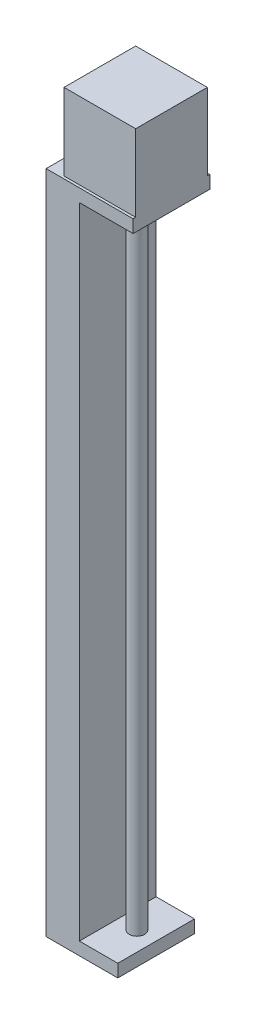
ISO-10303-21;
HEADER;
FILE_DESCRIPTION(('STEP AP214'),'2;1');
FILE_NAME('part.step','',(''),(''),'','','');
FILE_SCHEMA(('AUTOMOTIVE_DESIGN { 1 0 10303 214 1 1 1 1 }'));
ENDSEC;
DATA;
#1=APPLICATION_CONTEXT('core data for automotive mechanical design processes');
#2=APPLICATION_PROTOCOL_DEFINITION('international standard','automotive_design',2000,#1);
#3=PRODUCT_CONTEXT('',#1,'mechanical');
#4=PRODUCT('Part','Part','',(#3));
#5=PRODUCT_RELATED_PRODUCT_CATEGORY('part','',(#4));
#6=PRODUCT_DEFINITION_FORMATION('','',#4);
#7=PRODUCT_DEFINITION_CONTEXT('part definition',#1,'design');
#8=PRODUCT_DEFINITION('design','',#6,#7);
#9=PRODUCT_DEFINITION_SHAPE('','',#8);
#10=(LENGTH_UNIT() NAMED_UNIT(*) SI_UNIT(.MILLI.,.METRE.));
#11=(NAMED_UNIT(*) PLANE_ANGLE_UNIT() SI_UNIT($,.RADIAN.));
#12=(NAMED_UNIT(*) SI_UNIT($,.STERADIAN.) SOLID_ANGLE_UNIT());
#13=UNCERTAINTY_MEASURE_WITH_UNIT(LENGTH_MEASURE(1.E-05),#10,'distance_accuracy_value','');
#14=(GEOMETRIC_REPRESENTATION_CONTEXT(3) GLOBAL_UNCERTAINTY_ASSIGNED_CONTEXT((#13)) GLOBAL_UNIT_ASSIGNED_CONTEXT((#10,
#11,#12)) REPRESENTATION_CONTEXT('',''));
#15=CARTESIAN_POINT('',(0.,0.,0.));
#16=DIRECTION('',(0.,0.,1.));
#17=DIRECTION('',(1.,0.,0.));
#18=AXIS2_PLACEMENT_3D('',#15,#16,#17);
#19=CARTESIAN_POINT('',(0.,130.,15.));
#20=DIRECTION('',(0.,1.,0.));
#21=DIRECTION('',(0.,0.,1.));
#22=AXIS2_PLACEMENT_3D('',#19,#20,#21);
#23=PLANE('',#22);
#24=DIRECTION('',(0.,0.,-1.));
#25=VECTOR('',#24,1.);
#26=CARTESIAN_POINT('',(-11.,130.,14.));
#27=LINE('',#26,#25);
#28=CARTESIAN_POINT('',(-11.,130.,14.));
#29=VERTEX_POINT('',#28);
#30=CARTESIAN_POINT('',(-11.,130.,-14.));
#31=VERTEX_POINT('',#30);
#32=EDGE_CURVE('E216',#29,#31,#27,.T.);
#33=ORIENTED_EDGE('',*,*,#32,.T.);
#34=DIRECTION('',(1.,0.,0.));
#35=VECTOR('',#34,1.);
#36=CARTESIAN_POINT('',(0.,130.,-14.));
#37=LINE('',#36,#35);
#38=CARTESIAN_POINT('',(17.,130.,-14.));
#39=VERTEX_POINT('',#38);
#40=EDGE_CURVE('E50',#31,#39,#37,.T.);
#41=ORIENTED_EDGE('',*,*,#40,.T.);
#42=DIRECTION('',(0.,0.,-1.));
#43=VECTOR('',#42,1.);
#44=CARTESIAN_POINT('',(17.,130.,15.));
#45=LINE('',#44,#43);
#46=CARTESIAN_POINT('',(17.,130.,-15.));
#47=VERTEX_POINT('',#46);
#48=EDGE_CURVE('E175',#39,#47,#45,.T.);
#49=ORIENTED_EDGE('',*,*,#48,.T.);
#50=DIRECTION('',(1.,0.,0.));
#51=VECTOR('',#50,1.);
#52=CARTESIAN_POINT('',(0.,130.,-15.));
#53=LINE('',#52,#51);
#54=CARTESIAN_POINT('',(-17.,130.,-15.));
#55=VERTEX_POINT('',#54);
#56=EDGE_CURVE('E152',#55,#47,#53,.T.);
#57=ORIENTED_EDGE('',*,*,#56,.F.);
#58=DIRECTION('',(0.,0.,-1.));
#59=VECTOR('',#58,1.);
#60=CARTESIAN_POINT('',(-17.,130.,15.));
#61=LINE('',#60,#59);
#62=CARTESIAN_POINT('',(-17.,130.,15.));
#63=VERTEX_POINT('',#62);
#64=EDGE_CURVE('E173',#63,#55,#61,.T.);
#65=ORIENTED_EDGE('',*,*,#64,.F.);
#66=DIRECTION('',(1.,0.,0.));
#67=VECTOR('',#66,1.);
#68=CARTESIAN_POINT('',(0.,130.,15.));
#69=LINE('',#68,#67);
#70=CARTESIAN_POINT('',(17.,130.,15.));
#71=VERTEX_POINT('',#70);
#72=EDGE_CURVE('E233',#63,#71,#69,.T.);
#73=ORIENTED_EDGE('',*,*,#72,.T.);
#74=CARTESIAN_POINT('',(17.,130.,14.));
#75=VERTEX_POINT('',#74);
#76=EDGE_CURVE('E176',#71,#75,#45,.T.);
#77=ORIENTED_EDGE('',*,*,#76,.T.);
#78=DIRECTION('',(1.,0.,0.));
#79=VECTOR('',#78,1.);
#80=CARTESIAN_POINT('',(0.,130.,14.));
#81=LINE('',#80,#79);
#82=EDGE_CURVE('E204',#29,#75,#81,.T.);
#83=ORIENTED_EDGE('',*,*,#82,.F.);
#84=EDGE_LOOP('',(#33,#41,#49,#57,#65,#73,#77,#83));
#85=FACE_BOUND('',#84,.T.);
#86=ADVANCED_FACE('F35',(#85),#23,.T.);
#87=CARTESIAN_POINT('',(0.,125.,15.));
#88=DIRECTION('',(0.,-1.,0.));
#89=DIRECTION('',(0.,0.,-1.));
#90=AXIS2_PLACEMENT_3D('',#87,#88,#89);
#91=PLANE('',#90);
#92=CARTESIAN_POINT('',(3.50000000000015,125.,0.));
#93=DIRECTION('',(0.,-1.,0.));
#94=DIRECTION('',(0.,0.,-1.));
#95=AXIS2_PLACEMENT_3D('',#92,#93,#94);
#96=CIRCLE('',#95,3.);
#97=CARTESIAN_POINT('',(3.50000000000015,125.,-3.));
#98=VERTEX_POINT('',#97);
#99=EDGE_CURVE('E198',#98,#98,#96,.T.);
#100=ORIENTED_EDGE('',*,*,#99,.F.);
#101=EDGE_LOOP('',(#100));
#102=FACE_BOUND('',#101,.T.);
#103=DIRECTION('',(-1.,0.,0.));
#104=VECTOR('',#103,1.);
#105=CARTESIAN_POINT('',(0.,125.,-15.));
#106=LINE('',#105,#104);
#107=CARTESIAN_POINT('',(17.,125.,-15.));
#108=VERTEX_POINT('',#107);
#109=CARTESIAN_POINT('',(-4.,125.,-15.));
#110=VERTEX_POINT('',#109);
#111=EDGE_CURVE('E146',#108,#110,#106,.T.);
#112=ORIENTED_EDGE('',*,*,#111,.F.);
#113=DIRECTION('',(0.,0.,-1.));
#114=VECTOR('',#113,1.);
#115=CARTESIAN_POINT('',(17.,125.,15.));
#116=LINE('',#115,#114);
#117=CARTESIAN_POINT('',(17.,125.,15.));
#118=VERTEX_POINT('',#117);
#119=EDGE_CURVE('E43',#118,#108,#116,.T.);
#120=ORIENTED_EDGE('',*,*,#119,.F.);
#121=DIRECTION('',(-1.,0.,0.));
#122=VECTOR('',#121,1.);
#123=CARTESIAN_POINT('',(0.,125.,15.));
#124=LINE('',#123,#122);
#125=CARTESIAN_POINT('',(-4.,125.,15.));
#126=VERTEX_POINT('',#125);
#127=EDGE_CURVE('E167',#118,#126,#124,.T.);
#128=ORIENTED_EDGE('',*,*,#127,.T.);
#129=DIRECTION('',(0.,0.,-1.));
#130=VECTOR('',#129,1.);
#131=CARTESIAN_POINT('',(-4.,125.,15.));
#132=LINE('',#131,#130);
#133=EDGE_CURVE('E59',#126,#110,#132,.T.);
#134=ORIENTED_EDGE('',*,*,#133,.T.);
#135=EDGE_LOOP('',(#112,#120,#128,#134));
#136=FACE_BOUND('',#135,.T.);
#137=ADVANCED_FACE('F37',(#102,#136),#91,.T.);
#138=CARTESIAN_POINT('',(17.,0.,15.));
#139=DIRECTION('',(-1.,0.,0.));
#140=DIRECTION('',(0.,0.,1.));
#141=AXIS2_PLACEMENT_3D('',#138,#139,#140);
#142=PLANE('',#141);
#143=DIRECTION('',(0.,1.,0.));
#144=VECTOR('',#143,1.);
#145=CARTESIAN_POINT('',(17.,0.,-15.));
#146=LINE('',#145,#144);
#147=EDGE_CURVE('E148',#108,#47,#146,.T.);
#148=ORIENTED_EDGE('',*,*,#147,.T.);
#149=ORIENTED_EDGE('',*,*,#48,.F.);
#150=DIRECTION('',(0.,1.,0.));
#151=VECTOR('',#150,1.);
#152=CARTESIAN_POINT('',(17.,0.,-14.));
#153=LINE('',#152,#151);
#154=CARTESIAN_POINT('',(17.,160.,-14.));
#155=VERTEX_POINT('',#154);
#156=EDGE_CURVE('E201',#39,#155,#153,.T.);
#157=ORIENTED_EDGE('',*,*,#156,.T.);
#158=DIRECTION('',(0.,0.,-1.));
#159=VECTOR('',#158,1.);
#160=CARTESIAN_POINT('',(17.,160.,14.));
#161=LINE('',#160,#159);
#162=CARTESIAN_POINT('',(17.,160.,14.));
#163=VERTEX_POINT('',#162);
#164=EDGE_CURVE('E149',#163,#155,#161,.T.);
#165=ORIENTED_EDGE('',*,*,#164,.F.);
#166=DIRECTION('',(0.,1.,0.));
#167=VECTOR('',#166,1.);
#168=CARTESIAN_POINT('',(17.,0.,14.));
#169=LINE('',#168,#167);
#170=EDGE_CURVE('E207',#75,#163,#169,.T.);
#171=ORIENTED_EDGE('',*,*,#170,.F.);
#172=ORIENTED_EDGE('',*,*,#76,.F.);
#173=DIRECTION('',(0.,1.,0.));
#174=VECTOR('',#173,1.);
#175=CARTESIAN_POINT('',(17.,0.,15.));
#176=LINE('',#175,#174);
#177=EDGE_CURVE('E183',#118,#71,#176,.T.);
#178=ORIENTED_EDGE('',*,*,#177,.F.);
#179=ORIENTED_EDGE('',*,*,#119,.T.);
#180=EDGE_LOOP('',(#148,#149,#157,#165,#171,#172,#178,#179));
#181=FACE_BOUND('',#180,.T.);
#182=ADVANCED_FACE('F180',(#181),#142,.F.);
#183=CARTESIAN_POINT('',(-17.,0.,15.));
#184=DIRECTION('',(-1.,0.,0.));
#185=DIRECTION('',(0.,0.,1.));
#186=AXIS2_PLACEMENT_3D('',#183,#184,#185);
#187=PLANE('',#186);
#188=DIRECTION('',(0.,1.,0.));
#189=VECTOR('',#188,1.);
#190=CARTESIAN_POINT('',(-17.,0.,-15.));
#191=LINE('',#190,#189);
#192=CARTESIAN_POINT('',(-17.,-130.,-15.));
#193=VERTEX_POINT('',#192);
#194=EDGE_CURVE('E155',#193,#55,#191,.T.);
#195=ORIENTED_EDGE('',*,*,#194,.F.);
#196=DIRECTION('',(0.,0.,-1.));
#197=VECTOR('',#196,1.);
#198=CARTESIAN_POINT('',(-17.,-130.,15.));
#199=LINE('',#198,#197);
#200=CARTESIAN_POINT('',(-17.,-130.,15.));
#201=VERTEX_POINT('',#200);
#202=EDGE_CURVE('E171',#201,#193,#199,.T.);
#203=ORIENTED_EDGE('',*,*,#202,.F.);
#204=DIRECTION('',(0.,1.,0.));
#205=VECTOR('',#204,1.);
#206=CARTESIAN_POINT('',(-17.,0.,15.));
#207=LINE('',#206,#205);
#208=EDGE_CURVE('E141',#201,#63,#207,.T.);
#209=ORIENTED_EDGE('',*,*,#208,.T.);
#210=ORIENTED_EDGE('',*,*,#64,.T.);
#211=EDGE_LOOP('',(#195,#203,#209,#210));
#212=FACE_BOUND('',#211,.T.);
#213=ADVANCED_FACE('F193',(#212),#187,.T.);
#214=CARTESIAN_POINT('',(0.,-130.,15.));
#215=DIRECTION('',(0.,1.,0.));
#216=DIRECTION('',(0.,0.,1.));
#217=AXIS2_PLACEMENT_3D('',#214,#215,#216);
#218=PLANE('',#217);
#219=DIRECTION('',(1.,0.,0.));
#220=VECTOR('',#219,1.);
#221=CARTESIAN_POINT('',(0.,-130.,-15.));
#222=LINE('',#221,#220);
#223=CARTESIAN_POINT('',(11.,-130.,-15.));
#224=VERTEX_POINT('',#223);
#225=EDGE_CURVE('E158',#193,#224,#222,.T.);
#226=ORIENTED_EDGE('',*,*,#225,.T.);
#227=DIRECTION('',(0.,0.,-1.));
#228=VECTOR('',#227,1.);
#229=CARTESIAN_POINT('',(11.,-130.,15.));
#230=LINE('',#229,#228);
#231=CARTESIAN_POINT('',(11.,-130.,15.));
#232=VERTEX_POINT('',#231);
#233=EDGE_CURVE('E124',#232,#224,#230,.T.);
#234=ORIENTED_EDGE('',*,*,#233,.F.);
#235=DIRECTION('',(1.,0.,0.));
#236=VECTOR('',#235,1.);
#237=CARTESIAN_POINT('',(0.,-130.,15.));
#238=LINE('',#237,#236);
#239=EDGE_CURVE('E138',#201,#232,#238,.T.);
#240=ORIENTED_EDGE('',*,*,#239,.F.);
#241=ORIENTED_EDGE('',*,*,#202,.T.);
#242=EDGE_LOOP('',(#226,#234,#240,#241));
#243=FACE_BOUND('',#242,.T.);
#244=ADVANCED_FACE('F243',(#243),#218,.F.);
#245=CARTESIAN_POINT('',(11.,0.,15.));
#246=DIRECTION('',(1.,0.,0.));
#247=DIRECTION('',(0.,0.,-1.));
#248=AXIS2_PLACEMENT_3D('',#245,#246,#247);
#249=PLANE('',#248);
#250=DIRECTION('',(0.,-1.,0.));
#251=VECTOR('',#250,1.);
#252=CARTESIAN_POINT('',(11.,0.,-15.));
#253=LINE('',#252,#251);
#254=CARTESIAN_POINT('',(11.,-125.,-15.));
#255=VERTEX_POINT('',#254);
#256=EDGE_CURVE('E120',#255,#224,#253,.T.);
#257=ORIENTED_EDGE('',*,*,#256,.F.);
#258=DIRECTION('',(0.,0.,-1.));
#259=VECTOR('',#258,1.);
#260=CARTESIAN_POINT('',(11.,-125.,15.));
#261=LINE('',#260,#259);
#262=CARTESIAN_POINT('',(11.,-125.,15.));
#263=VERTEX_POINT('',#262);
#264=EDGE_CURVE('E114',#263,#255,#261,.T.);
#265=ORIENTED_EDGE('',*,*,#264,.F.);
#266=DIRECTION('',(0.,-1.,0.));
#267=VECTOR('',#266,1.);
#268=CARTESIAN_POINT('',(11.,0.,15.));
#269=LINE('',#268,#267);
#270=EDGE_CURVE('E118',#263,#232,#269,.T.);
#271=ORIENTED_EDGE('',*,*,#270,.T.);
#272=ORIENTED_EDGE('',*,*,#233,.T.);
#273=EDGE_LOOP('',(#257,#265,#271,#272));
#274=FACE_BOUND('',#273,.T.);
#275=ADVANCED_FACE('F116',(#274),#249,.T.);
#276=CARTESIAN_POINT('',(0.,-125.,15.));
#277=DIRECTION('',(0.,-1.,0.));
#278=DIRECTION('',(0.,0.,-1.));
#279=AXIS2_PLACEMENT_3D('',#276,#277,#278);
#280=PLANE('',#279);
#281=CARTESIAN_POINT('',(3.50000000000005,-125.,0.));
#282=DIRECTION('',(0.,-1.,0.));
#283=DIRECTION('',(0.,0.,-1.));
#284=AXIS2_PLACEMENT_3D('',#281,#282,#283);
#285=CIRCLE('',#284,3.);
#286=CARTESIAN_POINT('',(3.50000000000005,-125.,-3.));
#287=VERTEX_POINT('',#286);
#288=EDGE_CURVE('E11',#287,#287,#285,.F.);
#289=ORIENTED_EDGE('',*,*,#288,.F.);
#290=EDGE_LOOP('',(#289));
#291=FACE_BOUND('',#290,.T.);
#292=DIRECTION('',(-1.,0.,0.));
#293=VECTOR('',#292,1.);
#294=CARTESIAN_POINT('',(0.,-125.,-15.));
#295=LINE('',#294,#293);
#296=CARTESIAN_POINT('',(-4.,-125.,-15.));
#297=VERTEX_POINT('',#296);
#298=EDGE_CURVE('E162',#255,#297,#295,.T.);
#299=ORIENTED_EDGE('',*,*,#298,.T.);
#300=DIRECTION('',(0.,0.,-1.));
#301=VECTOR('',#300,1.);
#302=CARTESIAN_POINT('',(-4.,-125.,15.));
#303=LINE('',#302,#301);
#304=CARTESIAN_POINT('',(-4.,-125.,15.));
#305=VERTEX_POINT('',#304);
#306=EDGE_CURVE('E125',#305,#297,#303,.T.);
#307=ORIENTED_EDGE('',*,*,#306,.F.);
#308=DIRECTION('',(-1.,0.,0.));
#309=VECTOR('',#308,1.);
#310=CARTESIAN_POINT('',(0.,-125.,15.));
#311=LINE('',#310,#309);
#312=EDGE_CURVE('E128',#263,#305,#311,.T.);
#313=ORIENTED_EDGE('',*,*,#312,.F.);
#314=ORIENTED_EDGE('',*,*,#264,.T.);
#315=EDGE_LOOP('',(#299,#307,#313,#314));
#316=FACE_BOUND('',#315,.T.);
#317=ADVANCED_FACE('F129',(#291,#316),#280,.F.);
#318=CARTESIAN_POINT('',(-4.,0.,15.));
#319=DIRECTION('',(1.,0.,0.));
#320=DIRECTION('',(0.,1.,0.));
#321=AXIS2_PLACEMENT_3D('',#318,#319,#320);
#322=PLANE('',#321);
#323=DIRECTION('',(0.,-1.,0.));
#324=VECTOR('',#323,1.);
#325=CARTESIAN_POINT('',(-4.,0.,-15.));
#326=LINE('',#325,#324);
#327=EDGE_CURVE('E164',#110,#297,#326,.T.);
#328=ORIENTED_EDGE('',*,*,#327,.F.);
#329=ORIENTED_EDGE('',*,*,#133,.F.);
#330=DIRECTION('',(0.,-1.,0.));
#331=VECTOR('',#330,1.);
#332=CARTESIAN_POINT('',(-4.,0.,15.));
#333=LINE('',#332,#331);
#334=EDGE_CURVE('E132',#126,#305,#333,.T.);
#335=ORIENTED_EDGE('',*,*,#334,.T.);
#336=ORIENTED_EDGE('',*,*,#306,.T.);
#337=EDGE_LOOP('',(#328,#329,#335,#336));
#338=FACE_BOUND('',#337,.T.);
#339=ADVANCED_FACE('F255',(#338),#322,.T.);
#340=CARTESIAN_POINT('',(0.,0.,15.));
#341=DIRECTION('',(0.,0.,1.));
#342=DIRECTION('',(1.,0.,0.));
#343=AXIS2_PLACEMENT_3D('',#340,#341,#342);
#344=PLANE('',#343);
#345=ORIENTED_EDGE('',*,*,#127,.F.);
#346=ORIENTED_EDGE('',*,*,#177,.T.);
#347=ORIENTED_EDGE('',*,*,#72,.F.);
#348=ORIENTED_EDGE('',*,*,#208,.F.);
#349=ORIENTED_EDGE('',*,*,#239,.T.);
#350=ORIENTED_EDGE('',*,*,#270,.F.);
#351=ORIENTED_EDGE('',*,*,#312,.T.);
#352=ORIENTED_EDGE('',*,*,#334,.F.);
#353=EDGE_LOOP('',(#345,#346,#347,#348,#349,#350,#351,#352));
#354=FACE_BOUND('',#353,.T.);
#355=ADVANCED_FACE('F135',(#354),#344,.T.);
#356=CARTESIAN_POINT('',(0.,0.,-15.));
#357=DIRECTION('',(0.,0.,1.));
#358=DIRECTION('',(1.,0.,0.));
#359=AXIS2_PLACEMENT_3D('',#356,#357,#358);
#360=PLANE('',#359);
#361=ORIENTED_EDGE('',*,*,#111,.T.);
#362=ORIENTED_EDGE('',*,*,#327,.T.);
#363=ORIENTED_EDGE('',*,*,#298,.F.);
#364=ORIENTED_EDGE('',*,*,#256,.T.);
#365=ORIENTED_EDGE('',*,*,#225,.F.);
#366=ORIENTED_EDGE('',*,*,#194,.T.);
#367=ORIENTED_EDGE('',*,*,#56,.T.);
#368=ORIENTED_EDGE('',*,*,#147,.F.);
#369=EDGE_LOOP('',(#361,#362,#363,#364,#365,#366,#367,#368));
#370=FACE_BOUND('',#369,.T.);
#371=ADVANCED_FACE('F185',(#370),#360,.F.);
#372=CARTESIAN_POINT('',(0.,160.,14.));
#373=DIRECTION('',(0.,1.,0.));
#374=DIRECTION('',(0.,0.,1.));
#375=AXIS2_PLACEMENT_3D('',#372,#373,#374);
#376=PLANE('',#375);
#377=DIRECTION('',(1.,0.,0.));
#378=VECTOR('',#377,1.);
#379=CARTESIAN_POINT('',(0.,160.,-14.));
#380=LINE('',#379,#378);
#381=CARTESIAN_POINT('',(-11.,160.,-14.));
#382=VERTEX_POINT('',#381);
#383=EDGE_CURVE('E220',#382,#155,#380,.T.);
#384=ORIENTED_EDGE('',*,*,#383,.F.);
#385=DIRECTION('',(0.,0.,-1.));
#386=VECTOR('',#385,1.);
#387=CARTESIAN_POINT('',(-11.,160.,14.));
#388=LINE('',#387,#386);
#389=CARTESIAN_POINT('',(-11.,160.,14.));
#390=VERTEX_POINT('',#389);
#391=EDGE_CURVE('E226',#390,#382,#388,.T.);
#392=ORIENTED_EDGE('',*,*,#391,.F.);
#393=DIRECTION('',(1.,0.,0.));
#394=VECTOR('',#393,1.);
#395=CARTESIAN_POINT('',(0.,160.,14.));
#396=LINE('',#395,#394);
#397=EDGE_CURVE('E211',#390,#163,#396,.T.);
#398=ORIENTED_EDGE('',*,*,#397,.T.);
#399=ORIENTED_EDGE('',*,*,#164,.T.);
#400=EDGE_LOOP('',(#384,#392,#398,#399));
#401=FACE_BOUND('',#400,.T.);
#402=ADVANCED_FACE('F261',(#401),#376,.T.);
#403=CARTESIAN_POINT('',(-11.,0.,14.));
#404=DIRECTION('',(1.,0.,0.));
#405=DIRECTION('',(0.,1.,0.));
#406=AXIS2_PLACEMENT_3D('',#403,#404,#405);
#407=PLANE('',#406);
#408=DIRECTION('',(0.,-1.,0.));
#409=VECTOR('',#408,1.);
#410=CARTESIAN_POINT('',(-11.,0.,-14.));
#411=LINE('',#410,#409);
#412=EDGE_CURVE('E208',#382,#31,#411,.T.);
#413=ORIENTED_EDGE('',*,*,#412,.T.);
#414=ORIENTED_EDGE('',*,*,#32,.F.);
#415=DIRECTION('',(0.,-1.,0.));
#416=VECTOR('',#415,1.);
#417=CARTESIAN_POINT('',(-11.,0.,14.));
#418=LINE('',#417,#416);
#419=EDGE_CURVE('E214',#390,#29,#418,.T.);
#420=ORIENTED_EDGE('',*,*,#419,.F.);
#421=ORIENTED_EDGE('',*,*,#391,.T.);
#422=EDGE_LOOP('',(#413,#414,#420,#421));
#423=FACE_BOUND('',#422,.T.);
#424=ADVANCED_FACE('F266',(#423),#407,.F.);
#425=CARTESIAN_POINT('',(0.,0.,14.));
#426=DIRECTION('',(0.,0.,1.));
#427=DIRECTION('',(1.,0.,0.));
#428=AXIS2_PLACEMENT_3D('',#425,#426,#427);
#429=PLANE('',#428);
#430=ORIENTED_EDGE('',*,*,#82,.T.);
#431=ORIENTED_EDGE('',*,*,#170,.T.);
#432=ORIENTED_EDGE('',*,*,#397,.F.);
#433=ORIENTED_EDGE('',*,*,#419,.T.);
#434=EDGE_LOOP('',(#430,#431,#432,#433));
#435=FACE_BOUND('',#434,.T.);
#436=ADVANCED_FACE('F270',(#435),#429,.T.);
#437=CARTESIAN_POINT('',(0.,0.,-14.));
#438=DIRECTION('',(0.,0.,1.));
#439=DIRECTION('',(1.,0.,0.));
#440=AXIS2_PLACEMENT_3D('',#437,#438,#439);
#441=PLANE('',#440);
#442=ORIENTED_EDGE('',*,*,#40,.F.);
#443=ORIENTED_EDGE('',*,*,#412,.F.);
#444=ORIENTED_EDGE('',*,*,#383,.T.);
#445=ORIENTED_EDGE('',*,*,#156,.F.);
#446=EDGE_LOOP('',(#442,#443,#444,#445));
#447=FACE_BOUND('',#446,.T.);
#448=ADVANCED_FACE('F272',(#447),#441,.F.);
#449=CARTESIAN_POINT('',(3.50000000000016,133.485281374239,0.));
#450=DIRECTION('',(0.,-1.,0.));
#451=DIRECTION('',(1.,0.,0.));
#452=AXIS2_PLACEMENT_3D('',#449,#450,#451);
#453=CYLINDRICAL_SURFACE('',#452,3.);
#454=ORIENTED_EDGE('',*,*,#99,.T.);
#455=EDGE_LOOP('',(#454));
#456=FACE_BOUND('',#455,.T.);
#457=ORIENTED_EDGE('',*,*,#288,.T.);
#458=EDGE_LOOP('',(#457));
#459=FACE_BOUND('',#458,.T.);
#460=ADVANCED_FACE('F275',(#456,#459),#453,.T.);
#461=CLOSED_SHELL('',(#86,#137,#182,#213,#244,#275,#317,#339,#355,#371,#402,#424,#436,#448,#460));
#462=MANIFOLD_SOLID_BREP('B2',#461);
#463=ADVANCED_BREP_SHAPE_REPRESENTATION('',(#18,#462),#14);
#464=SHAPE_DEFINITION_REPRESENTATION(#9,#463);
ENDSEC;
END-ISO-10303-21;
